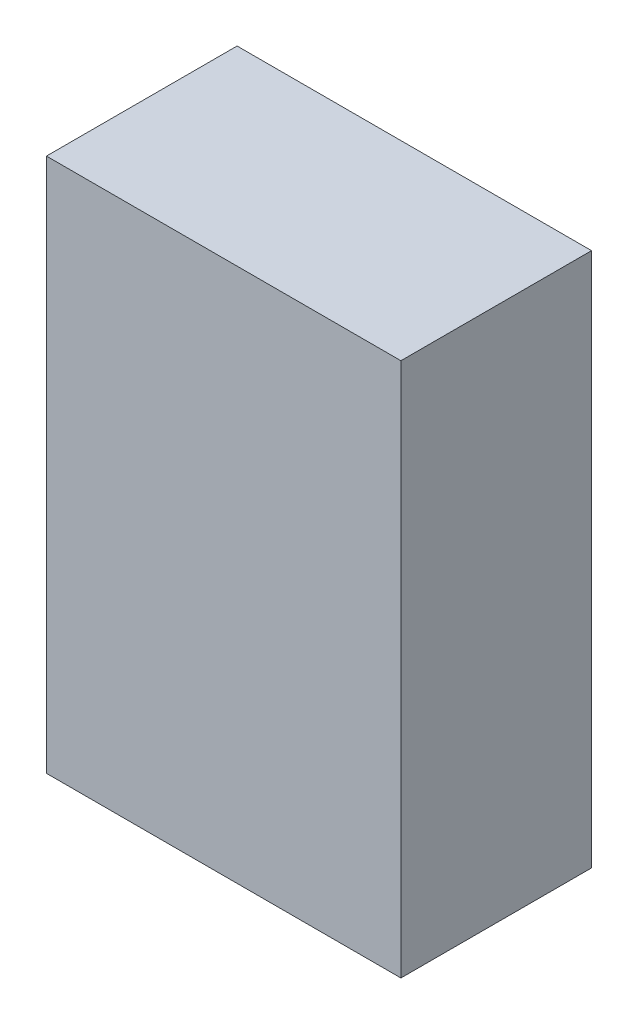
ISO-10303-21;
HEADER;
FILE_DESCRIPTION(('STEP AP214'),'2;1');
FILE_NAME('part.step','',(''),(''),'','','');
FILE_SCHEMA(('AUTOMOTIVE_DESIGN { 1 0 10303 214 1 1 1 1 }'));
ENDSEC;
DATA;
#1=APPLICATION_CONTEXT('core data for automotive mechanical design processes');
#2=APPLICATION_PROTOCOL_DEFINITION('international standard','automotive_design',2000,#1);
#3=PRODUCT_CONTEXT('',#1,'mechanical');
#4=PRODUCT('Part','Part','',(#3));
#5=PRODUCT_RELATED_PRODUCT_CATEGORY('part','',(#4));
#6=PRODUCT_DEFINITION_FORMATION('','',#4);
#7=PRODUCT_DEFINITION_CONTEXT('part definition',#1,'design');
#8=PRODUCT_DEFINITION('design','',#6,#7);
#9=PRODUCT_DEFINITION_SHAPE('','',#8);
#10=(LENGTH_UNIT() NAMED_UNIT(*) SI_UNIT(.MILLI.,.METRE.));
#11=(NAMED_UNIT(*) PLANE_ANGLE_UNIT() SI_UNIT($,.RADIAN.));
#12=(NAMED_UNIT(*) SI_UNIT($,.STERADIAN.) SOLID_ANGLE_UNIT());
#13=UNCERTAINTY_MEASURE_WITH_UNIT(LENGTH_MEASURE(1.E-05),#10,'distance_accuracy_value','');
#14=(GEOMETRIC_REPRESENTATION_CONTEXT(3) GLOBAL_UNCERTAINTY_ASSIGNED_CONTEXT((#13)) GLOBAL_UNIT_ASSIGNED_CONTEXT((#10,
#11,#12)) REPRESENTATION_CONTEXT('',''));
#15=CARTESIAN_POINT('',(0.,0.,0.));
#16=DIRECTION('',(0.,0.,1.));
#17=DIRECTION('',(1.,0.,0.));
#18=AXIS2_PLACEMENT_3D('',#15,#16,#17);
#19=CARTESIAN_POINT('',(0.,0.,1.));
#20=DIRECTION('',(1.,0.,0.));
#21=DIRECTION('',(0.,0.,-1.));
#22=AXIS2_PLACEMENT_3D('',#19,#20,#21);
#23=PLANE('',#22);
#24=DIRECTION('',(0.,-1.,0.));
#25=VECTOR('',#24,1.);
#26=CARTESIAN_POINT('',(0.,0.,0.));
#27=LINE('',#26,#25);
#28=CARTESIAN_POINT('',(0.,2.8042,0.));
#29=VERTEX_POINT('',#28);
#30=CARTESIAN_POINT('',(0.,0.,0.));
#31=VERTEX_POINT('',#30);
#32=EDGE_CURVE('E95',#29,#31,#27,.T.);
#33=ORIENTED_EDGE('',*,*,#32,.T.);
#34=DIRECTION('',(0.,0.,-1.));
#35=VECTOR('',#34,1.);
#36=CARTESIAN_POINT('',(0.,0.,1.));
#37=LINE('',#36,#35);
#38=CARTESIAN_POINT('',(0.,0.,1.));
#39=VERTEX_POINT('',#38);
#40=EDGE_CURVE('E11',#39,#31,#37,.T.);
#41=ORIENTED_EDGE('',*,*,#40,.F.);
#42=DIRECTION('',(0.,-1.,0.));
#43=VECTOR('',#42,1.);
#44=CARTESIAN_POINT('',(0.,0.,1.));
#45=LINE('',#44,#43);
#46=CARTESIAN_POINT('',(0.,2.8042,1.));
#47=VERTEX_POINT('',#46);
#48=EDGE_CURVE('E83',#47,#39,#45,.T.);
#49=ORIENTED_EDGE('',*,*,#48,.F.);
#50=DIRECTION('',(0.,0.,-1.));
#51=VECTOR('',#50,1.);
#52=CARTESIAN_POINT('',(0.,2.8042,1.));
#53=LINE('',#52,#51);
#54=EDGE_CURVE('E91',#47,#29,#53,.T.);
#55=ORIENTED_EDGE('',*,*,#54,.T.);
#56=EDGE_LOOP('',(#33,#41,#49,#55));
#57=FACE_BOUND('',#56,.T.);
#58=ADVANCED_FACE('F32',(#57),#23,.F.);
#59=CARTESIAN_POINT('',(1.8593,0.,1.));
#60=DIRECTION('',(0.,1.,0.));
#61=DIRECTION('',(0.,0.,1.));
#62=AXIS2_PLACEMENT_3D('',#59,#60,#61);
#63=PLANE('',#62);
#64=DIRECTION('',(1.,0.,0.));
#65=VECTOR('',#64,1.);
#66=CARTESIAN_POINT('',(1.8593,0.,0.));
#67=LINE('',#66,#65);
#68=CARTESIAN_POINT('',(1.8593,0.,0.));
#69=VERTEX_POINT('',#68);
#70=EDGE_CURVE('E87',#31,#69,#67,.T.);
#71=ORIENTED_EDGE('',*,*,#70,.T.);
#72=DIRECTION('',(0.,0.,-1.));
#73=VECTOR('',#72,1.);
#74=CARTESIAN_POINT('',(1.8593,0.,1.));
#75=LINE('',#74,#73);
#76=CARTESIAN_POINT('',(1.8593,0.,1.));
#77=VERTEX_POINT('',#76);
#78=EDGE_CURVE('E40',#77,#69,#75,.T.);
#79=ORIENTED_EDGE('',*,*,#78,.F.);
#80=DIRECTION('',(1.,0.,0.));
#81=VECTOR('',#80,1.);
#82=CARTESIAN_POINT('',(1.8593,0.,1.));
#83=LINE('',#82,#81);
#84=EDGE_CURVE('E78',#39,#77,#83,.T.);
#85=ORIENTED_EDGE('',*,*,#84,.F.);
#86=ORIENTED_EDGE('',*,*,#40,.T.);
#87=EDGE_LOOP('',(#71,#79,#85,#86));
#88=FACE_BOUND('',#87,.T.);
#89=ADVANCED_FACE('F86',(#88),#63,.F.);
#90=CARTESIAN_POINT('',(1.8593,2.8042,1.));
#91=DIRECTION('',(-1.,0.,0.));
#92=DIRECTION('',(0.,0.,1.));
#93=AXIS2_PLACEMENT_3D('',#90,#91,#92);
#94=PLANE('',#93);
#95=DIRECTION('',(0.,1.,0.));
#96=VECTOR('',#95,1.);
#97=CARTESIAN_POINT('',(1.8593,2.8042,0.));
#98=LINE('',#97,#96);
#99=CARTESIAN_POINT('',(1.8593,2.8042,0.));
#100=VERTEX_POINT('',#99);
#101=EDGE_CURVE('E65',#69,#100,#98,.T.);
#102=ORIENTED_EDGE('',*,*,#101,.T.);
#103=DIRECTION('',(0.,0.,-1.));
#104=VECTOR('',#103,1.);
#105=CARTESIAN_POINT('',(1.8593,2.8042,1.));
#106=LINE('',#105,#104);
#107=CARTESIAN_POINT('',(1.8593,2.8042,1.));
#108=VERTEX_POINT('',#107);
#109=EDGE_CURVE('E88',#108,#100,#106,.T.);
#110=ORIENTED_EDGE('',*,*,#109,.F.);
#111=DIRECTION('',(0.,1.,0.));
#112=VECTOR('',#111,1.);
#113=CARTESIAN_POINT('',(1.8593,2.8042,1.));
#114=LINE('',#113,#112);
#115=EDGE_CURVE('E81',#77,#108,#114,.T.);
#116=ORIENTED_EDGE('',*,*,#115,.F.);
#117=ORIENTED_EDGE('',*,*,#78,.T.);
#118=EDGE_LOOP('',(#102,#110,#116,#117));
#119=FACE_BOUND('',#118,.T.);
#120=ADVANCED_FACE('F89',(#119),#94,.F.);
#121=CARTESIAN_POINT('',(0.,2.8042,1.));
#122=DIRECTION('',(0.,-1.,0.));
#123=DIRECTION('',(0.,0.,-1.));
#124=AXIS2_PLACEMENT_3D('',#121,#122,#123);
#125=PLANE('',#124);
#126=DIRECTION('',(-1.,0.,0.));
#127=VECTOR('',#126,1.);
#128=CARTESIAN_POINT('',(0.,2.8042,0.));
#129=LINE('',#128,#127);
#130=EDGE_CURVE('E71',#100,#29,#129,.T.);
#131=ORIENTED_EDGE('',*,*,#130,.T.);
#132=ORIENTED_EDGE('',*,*,#54,.F.);
#133=DIRECTION('',(-1.,0.,0.));
#134=VECTOR('',#133,1.);
#135=CARTESIAN_POINT('',(0.,2.8042,1.));
#136=LINE('',#135,#134);
#137=EDGE_CURVE('E48',#108,#47,#136,.T.);
#138=ORIENTED_EDGE('',*,*,#137,.F.);
#139=ORIENTED_EDGE('',*,*,#109,.T.);
#140=EDGE_LOOP('',(#131,#132,#138,#139));
#141=FACE_BOUND('',#140,.T.);
#142=ADVANCED_FACE('F102',(#141),#125,.F.);
#143=CARTESIAN_POINT('',(0.,0.,1.));
#144=DIRECTION('',(0.,0.,-1.));
#145=DIRECTION('',(-1.,0.,0.));
#146=AXIS2_PLACEMENT_3D('',#143,#144,#145);
#147=PLANE('',#146);
#148=ORIENTED_EDGE('',*,*,#48,.T.);
#149=ORIENTED_EDGE('',*,*,#84,.T.);
#150=ORIENTED_EDGE('',*,*,#115,.T.);
#151=ORIENTED_EDGE('',*,*,#137,.T.);
#152=EDGE_LOOP('',(#148,#149,#150,#151));
#153=FACE_BOUND('',#152,.T.);
#154=ADVANCED_FACE('F79',(#153),#147,.F.);
#155=CARTESIAN_POINT('',(0.,0.,0.));
#156=DIRECTION('',(0.,0.,-1.));
#157=DIRECTION('',(-1.,0.,0.));
#158=AXIS2_PLACEMENT_3D('',#155,#156,#157);
#159=PLANE('',#158);
#160=ORIENTED_EDGE('',*,*,#32,.F.);
#161=ORIENTED_EDGE('',*,*,#130,.F.);
#162=ORIENTED_EDGE('',*,*,#101,.F.);
#163=ORIENTED_EDGE('',*,*,#70,.F.);
#164=EDGE_LOOP('',(#160,#161,#162,#163));
#165=FACE_BOUND('',#164,.T.);
#166=ADVANCED_FACE('F105',(#165),#159,.T.);
#167=CLOSED_SHELL('',(#58,#89,#120,#142,#154,#166));
#168=MANIFOLD_SOLID_BREP('B2',#167);
#169=ADVANCED_BREP_SHAPE_REPRESENTATION('',(#18,#168),#14);
#170=SHAPE_DEFINITION_REPRESENTATION(#9,#169);
ENDSEC;
END-ISO-10303-21;
